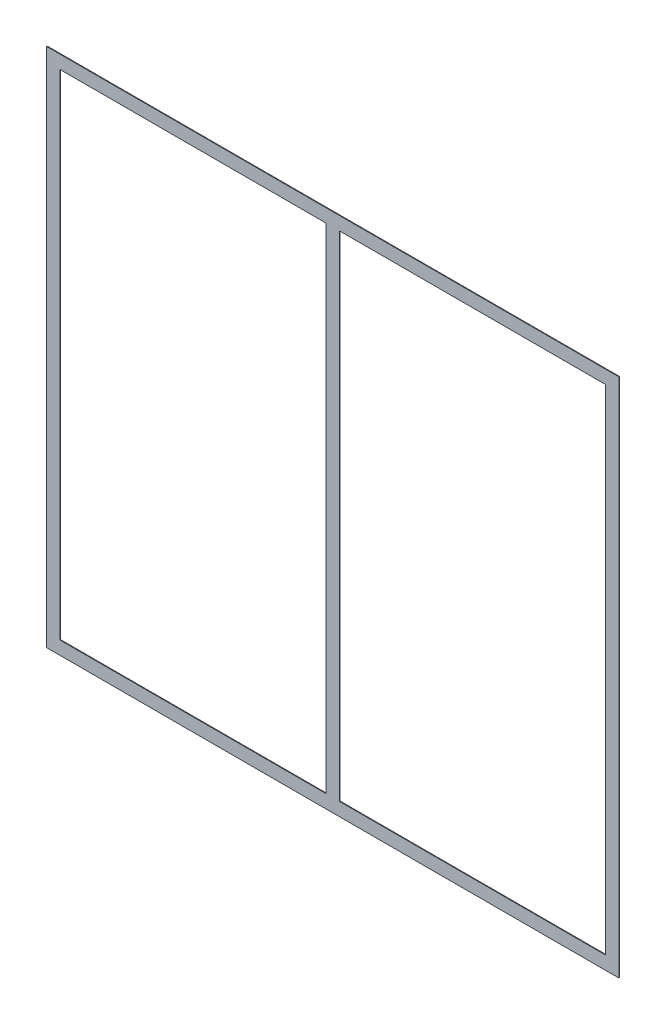
ISO-10303-21;
HEADER;
FILE_DESCRIPTION(('STEP AP214'),'2;1');
FILE_NAME('part.step','',(''),(''),'','','');
FILE_SCHEMA(('AUTOMOTIVE_DESIGN { 1 0 10303 214 1 1 1 1 }'));
ENDSEC;
DATA;
#1=APPLICATION_CONTEXT('core data for automotive mechanical design processes');
#2=APPLICATION_PROTOCOL_DEFINITION('international standard','automotive_design',2000,#1);
#3=PRODUCT_CONTEXT('',#1,'mechanical');
#4=PRODUCT('Part','Part','',(#3));
#5=PRODUCT_RELATED_PRODUCT_CATEGORY('part','',(#4));
#6=PRODUCT_DEFINITION_FORMATION('','',#4);
#7=PRODUCT_DEFINITION_CONTEXT('part definition',#1,'design');
#8=PRODUCT_DEFINITION('design','',#6,#7);
#9=PRODUCT_DEFINITION_SHAPE('','',#8);
#10=(LENGTH_UNIT() NAMED_UNIT(*) SI_UNIT(.MILLI.,.METRE.));
#11=(NAMED_UNIT(*) PLANE_ANGLE_UNIT() SI_UNIT($,.RADIAN.));
#12=(NAMED_UNIT(*) SI_UNIT($,.STERADIAN.) SOLID_ANGLE_UNIT());
#13=UNCERTAINTY_MEASURE_WITH_UNIT(LENGTH_MEASURE(1.E-05),#10,'distance_accuracy_value','');
#14=(GEOMETRIC_REPRESENTATION_CONTEXT(3) GLOBAL_UNCERTAINTY_ASSIGNED_CONTEXT((#13)) GLOBAL_UNIT_ASSIGNED_CONTEXT((#10,
#11,#12)) REPRESENTATION_CONTEXT('',''));
#15=CARTESIAN_POINT('',(0.,0.,0.));
#16=DIRECTION('',(0.,0.,1.));
#17=DIRECTION('',(1.,0.,0.));
#18=AXIS2_PLACEMENT_3D('',#15,#16,#17);
#19=CARTESIAN_POINT('',(571.5,-1177.925,0.));
#20=DIRECTION('',(0.,-1.,0.));
#21=DIRECTION('',(0.,0.,-1.));
#22=AXIS2_PLACEMENT_3D('',#19,#20,#21);
#23=PLANE('',#22);
#24=DIRECTION('',(1.,0.,0.));
#25=VECTOR('',#24,1.);
#26=CARTESIAN_POINT('',(571.5,-1177.925,0.));
#27=LINE('',#26,#25);
#28=CARTESIAN_POINT('',(571.5,-1177.925,0.));
#29=VERTEX_POINT('',#28);
#30=CARTESIAN_POINT('',(1587.5,-1177.925,0.));
#31=VERTEX_POINT('',#30);
#32=EDGE_CURVE('E34',#29,#31,#27,.T.);
#33=ORIENTED_EDGE('',*,*,#32,.F.);
#34=DIRECTION('',(0.,0.,1.));
#35=VECTOR('',#34,1.);
#36=CARTESIAN_POINT('',(571.5,-1177.925,0.));
#37=LINE('',#36,#35);
#38=CARTESIAN_POINT('',(571.5,-1177.925,2.54));
#39=VERTEX_POINT('',#38);
#40=EDGE_CURVE('E10',#29,#39,#37,.T.);
#41=ORIENTED_EDGE('',*,*,#40,.T.);
#42=DIRECTION('',(-1.,0.,0.));
#43=VECTOR('',#42,1.);
#44=CARTESIAN_POINT('',(1587.5,-1177.925,2.54));
#45=LINE('',#44,#43);
#46=CARTESIAN_POINT('',(1587.5,-1177.925,2.54));
#47=VERTEX_POINT('',#46);
#48=EDGE_CURVE('E133',#47,#39,#45,.T.);
#49=ORIENTED_EDGE('',*,*,#48,.F.);
#50=DIRECTION('',(0.,0.,1.));
#51=VECTOR('',#50,1.);
#52=CARTESIAN_POINT('',(1587.5,-1177.925,0.));
#53=LINE('',#52,#51);
#54=EDGE_CURVE('E233',#31,#47,#53,.T.);
#55=ORIENTED_EDGE('',*,*,#54,.F.);
#56=EDGE_LOOP('',(#33,#41,#49,#55));
#57=FACE_BOUND('',#56,.T.);
#58=ADVANCED_FACE('F16',(#57),#23,.F.);
#59=CARTESIAN_POINT('',(571.499999999999,708.025,0.));
#60=DIRECTION('',(-1.,0.,0.));
#61=DIRECTION('',(0.,0.,1.));
#62=AXIS2_PLACEMENT_3D('',#59,#60,#61);
#63=PLANE('',#62);
#64=DIRECTION('',(0.,-1.,0.));
#65=VECTOR('',#64,1.);
#66=CARTESIAN_POINT('',(571.499999999999,708.025,0.));
#67=LINE('',#66,#65);
#68=CARTESIAN_POINT('',(571.499999999999,708.025,0.));
#69=VERTEX_POINT('',#68);
#70=EDGE_CURVE('E214',#69,#29,#67,.T.);
#71=ORIENTED_EDGE('',*,*,#70,.F.);
#72=DIRECTION('',(0.,0.,1.));
#73=VECTOR('',#72,1.);
#74=CARTESIAN_POINT('',(571.499999999999,708.025,0.));
#75=LINE('',#74,#73);
#76=CARTESIAN_POINT('',(571.499999999999,708.025,2.54));
#77=VERTEX_POINT('',#76);
#78=EDGE_CURVE('E26',#69,#77,#75,.T.);
#79=ORIENTED_EDGE('',*,*,#78,.T.);
#80=DIRECTION('',(0.,1.,0.));
#81=VECTOR('',#80,1.);
#82=CARTESIAN_POINT('',(571.5,-1177.925,2.54));
#83=LINE('',#82,#81);
#84=EDGE_CURVE('E243',#39,#77,#83,.T.);
#85=ORIENTED_EDGE('',*,*,#84,.F.);
#86=ORIENTED_EDGE('',*,*,#40,.F.);
#87=EDGE_LOOP('',(#71,#79,#85,#86));
#88=FACE_BOUND('',#87,.T.);
#89=ADVANCED_FACE('F170',(#88),#63,.F.);
#90=CARTESIAN_POINT('',(1587.5,708.025,0.));
#91=DIRECTION('',(0.,1.,0.));
#92=DIRECTION('',(0.,0.,1.));
#93=AXIS2_PLACEMENT_3D('',#90,#91,#92);
#94=PLANE('',#93);
#95=DIRECTION('',(-1.,0.,0.));
#96=VECTOR('',#95,1.);
#97=CARTESIAN_POINT('',(1587.5,708.025,0.));
#98=LINE('',#97,#96);
#99=CARTESIAN_POINT('',(1587.5,708.025,0.));
#100=VERTEX_POINT('',#99);
#101=EDGE_CURVE('E241',#100,#69,#98,.T.);
#102=ORIENTED_EDGE('',*,*,#101,.F.);
#103=DIRECTION('',(0.,0.,1.));
#104=VECTOR('',#103,1.);
#105=CARTESIAN_POINT('',(1587.5,708.025,0.));
#106=LINE('',#105,#104);
#107=CARTESIAN_POINT('',(1587.5,708.025,2.54));
#108=VERTEX_POINT('',#107);
#109=EDGE_CURVE('E244',#100,#108,#106,.T.);
#110=ORIENTED_EDGE('',*,*,#109,.T.);
#111=DIRECTION('',(1.,0.,0.));
#112=VECTOR('',#111,1.);
#113=CARTESIAN_POINT('',(571.499999999999,708.025,2.54));
#114=LINE('',#113,#112);
#115=EDGE_CURVE('E237',#77,#108,#114,.T.);
#116=ORIENTED_EDGE('',*,*,#115,.F.);
#117=ORIENTED_EDGE('',*,*,#78,.F.);
#118=EDGE_LOOP('',(#102,#110,#116,#117));
#119=FACE_BOUND('',#118,.T.);
#120=ADVANCED_FACE('F175',(#119),#94,.F.);
#121=CARTESIAN_POINT('',(1587.5,-1177.925,0.));
#122=DIRECTION('',(1.,0.,0.));
#123=DIRECTION('',(0.,0.,-1.));
#124=AXIS2_PLACEMENT_3D('',#121,#122,#123);
#125=PLANE('',#124);
#126=DIRECTION('',(0.,1.,0.));
#127=VECTOR('',#126,1.);
#128=CARTESIAN_POINT('',(1587.5,-1177.925,0.));
#129=LINE('',#128,#127);
#130=EDGE_CURVE('E238',#31,#100,#129,.T.);
#131=ORIENTED_EDGE('',*,*,#130,.F.);
#132=ORIENTED_EDGE('',*,*,#54,.T.);
#133=DIRECTION('',(0.,-1.,0.));
#134=VECTOR('',#133,1.);
#135=CARTESIAN_POINT('',(1587.5,708.025,2.54));
#136=LINE('',#135,#134);
#137=EDGE_CURVE('E231',#108,#47,#136,.T.);
#138=ORIENTED_EDGE('',*,*,#137,.F.);
#139=ORIENTED_EDGE('',*,*,#109,.F.);
#140=EDGE_LOOP('',(#131,#132,#138,#139));
#141=FACE_BOUND('',#140,.T.);
#142=ADVANCED_FACE('F181',(#141),#125,.F.);
#143=CARTESIAN_POINT('',(520.699999999999,708.025,0.));
#144=DIRECTION('',(0.,1.,0.));
#145=DIRECTION('',(0.,0.,1.));
#146=AXIS2_PLACEMENT_3D('',#143,#144,#145);
#147=PLANE('',#146);
#148=DIRECTION('',(-1.,0.,0.));
#149=VECTOR('',#148,1.);
#150=CARTESIAN_POINT('',(520.699999999999,708.025,0.));
#151=LINE('',#150,#149);
#152=CARTESIAN_POINT('',(520.699999999999,708.025,0.));
#153=VERTEX_POINT('',#152);
#154=CARTESIAN_POINT('',(-495.300000000001,708.024999999999,0.));
#155=VERTEX_POINT('',#154);
#156=EDGE_CURVE('E211',#153,#155,#151,.T.);
#157=ORIENTED_EDGE('',*,*,#156,.F.);
#158=DIRECTION('',(0.,0.,1.));
#159=VECTOR('',#158,1.);
#160=CARTESIAN_POINT('',(520.699999999999,708.025,0.));
#161=LINE('',#160,#159);
#162=CARTESIAN_POINT('',(520.699999999999,708.025,2.54));
#163=VERTEX_POINT('',#162);
#164=EDGE_CURVE('E227',#153,#163,#161,.T.);
#165=ORIENTED_EDGE('',*,*,#164,.T.);
#166=DIRECTION('',(1.,0.,0.));
#167=VECTOR('',#166,1.);
#168=CARTESIAN_POINT('',(-495.300000000001,708.024999999999,2.54));
#169=LINE('',#168,#167);
#170=CARTESIAN_POINT('',(-495.300000000001,708.024999999999,2.54));
#171=VERTEX_POINT('',#170);
#172=EDGE_CURVE('E224',#171,#163,#169,.T.);
#173=ORIENTED_EDGE('',*,*,#172,.F.);
#174=DIRECTION('',(0.,0.,1.));
#175=VECTOR('',#174,1.);
#176=CARTESIAN_POINT('',(-495.300000000001,708.024999999999,0.));
#177=LINE('',#176,#175);
#178=EDGE_CURVE('E138',#155,#171,#177,.T.);
#179=ORIENTED_EDGE('',*,*,#178,.F.);
#180=EDGE_LOOP('',(#157,#165,#173,#179));
#181=FACE_BOUND('',#180,.T.);
#182=ADVANCED_FACE('F185',(#181),#147,.F.);
#183=CARTESIAN_POINT('',(520.7,-1177.925,0.));
#184=DIRECTION('',(1.,0.,0.));
#185=DIRECTION('',(0.,0.,-1.));
#186=AXIS2_PLACEMENT_3D('',#183,#184,#185);
#187=PLANE('',#186);
#188=DIRECTION('',(0.,1.,0.));
#189=VECTOR('',#188,1.);
#190=CARTESIAN_POINT('',(520.7,-1177.925,0.));
#191=LINE('',#190,#189);
#192=CARTESIAN_POINT('',(520.7,-1177.925,0.));
#193=VERTEX_POINT('',#192);
#194=EDGE_CURVE('E216',#193,#153,#191,.T.);
#195=ORIENTED_EDGE('',*,*,#194,.F.);
#196=DIRECTION('',(0.,0.,1.));
#197=VECTOR('',#196,1.);
#198=CARTESIAN_POINT('',(520.7,-1177.925,0.));
#199=LINE('',#198,#197);
#200=CARTESIAN_POINT('',(520.7,-1177.925,2.54));
#201=VERTEX_POINT('',#200);
#202=EDGE_CURVE('E221',#193,#201,#199,.T.);
#203=ORIENTED_EDGE('',*,*,#202,.T.);
#204=DIRECTION('',(0.,-1.,0.));
#205=VECTOR('',#204,1.);
#206=CARTESIAN_POINT('',(520.699999999999,708.025,2.54));
#207=LINE('',#206,#205);
#208=EDGE_CURVE('E220',#163,#201,#207,.T.);
#209=ORIENTED_EDGE('',*,*,#208,.F.);
#210=ORIENTED_EDGE('',*,*,#164,.F.);
#211=EDGE_LOOP('',(#195,#203,#209,#210));
#212=FACE_BOUND('',#211,.T.);
#213=ADVANCED_FACE('F189',(#212),#187,.F.);
#214=CARTESIAN_POINT('',(-495.3,-1177.925,0.));
#215=DIRECTION('',(0.,-1.,0.));
#216=DIRECTION('',(0.,0.,-1.));
#217=AXIS2_PLACEMENT_3D('',#214,#215,#216);
#218=PLANE('',#217);
#219=DIRECTION('',(1.,0.,0.));
#220=VECTOR('',#219,1.);
#221=CARTESIAN_POINT('',(-495.3,-1177.925,0.));
#222=LINE('',#221,#220);
#223=CARTESIAN_POINT('',(-495.3,-1177.925,0.));
#224=VERTEX_POINT('',#223);
#225=EDGE_CURVE('E212',#224,#193,#222,.T.);
#226=ORIENTED_EDGE('',*,*,#225,.F.);
#227=DIRECTION('',(0.,0.,1.));
#228=VECTOR('',#227,1.);
#229=CARTESIAN_POINT('',(-495.3,-1177.925,0.));
#230=LINE('',#229,#228);
#231=CARTESIAN_POINT('',(-495.3,-1177.925,2.54));
#232=VERTEX_POINT('',#231);
#233=EDGE_CURVE('E142',#224,#232,#230,.T.);
#234=ORIENTED_EDGE('',*,*,#233,.T.);
#235=DIRECTION('',(-1.,0.,0.));
#236=VECTOR('',#235,1.);
#237=CARTESIAN_POINT('',(520.7,-1177.925,2.54));
#238=LINE('',#237,#236);
#239=EDGE_CURVE('E154',#201,#232,#238,.T.);
#240=ORIENTED_EDGE('',*,*,#239,.F.);
#241=ORIENTED_EDGE('',*,*,#202,.F.);
#242=EDGE_LOOP('',(#226,#234,#240,#241));
#243=FACE_BOUND('',#242,.T.);
#244=ADVANCED_FACE('F193',(#243),#218,.F.);
#245=CARTESIAN_POINT('',(-495.300000000001,708.024999999999,0.));
#246=DIRECTION('',(-1.,0.,0.));
#247=DIRECTION('',(0.,0.,1.));
#248=AXIS2_PLACEMENT_3D('',#245,#246,#247);
#249=PLANE('',#248);
#250=DIRECTION('',(0.,-1.,0.));
#251=VECTOR('',#250,1.);
#252=CARTESIAN_POINT('',(-495.300000000001,708.024999999999,0.));
#253=LINE('',#252,#251);
#254=EDGE_CURVE('E205',#155,#224,#253,.T.);
#255=ORIENTED_EDGE('',*,*,#254,.F.);
#256=ORIENTED_EDGE('',*,*,#178,.T.);
#257=DIRECTION('',(0.,1.,0.));
#258=VECTOR('',#257,1.);
#259=CARTESIAN_POINT('',(-495.3,-1177.925,2.54));
#260=LINE('',#259,#258);
#261=EDGE_CURVE('E152',#232,#171,#260,.T.);
#262=ORIENTED_EDGE('',*,*,#261,.F.);
#263=ORIENTED_EDGE('',*,*,#233,.F.);
#264=EDGE_LOOP('',(#255,#256,#262,#263));
#265=FACE_BOUND('',#264,.T.);
#266=ADVANCED_FACE('F167',(#265),#249,.F.);
#267=CARTESIAN_POINT('',(-546.1,-1228.725,0.));
#268=DIRECTION('',(0.,-1.,0.));
#269=DIRECTION('',(0.,0.,-1.));
#270=AXIS2_PLACEMENT_3D('',#267,#268,#269);
#271=PLANE('',#270);
#272=DIRECTION('',(-1.,0.,0.));
#273=VECTOR('',#272,1.);
#274=CARTESIAN_POINT('',(1638.3,-1228.725,0.));
#275=LINE('',#274,#273);
#276=CARTESIAN_POINT('',(1638.3,-1228.725,0.));
#277=VERTEX_POINT('',#276);
#278=CARTESIAN_POINT('',(-546.1,-1228.725,0.));
#279=VERTEX_POINT('',#278);
#280=EDGE_CURVE('E137',#277,#279,#275,.T.);
#281=ORIENTED_EDGE('',*,*,#280,.F.);
#282=DIRECTION('',(0.,0.,1.));
#283=VECTOR('',#282,1.);
#284=CARTESIAN_POINT('',(1638.3,-1228.725,0.));
#285=LINE('',#284,#283);
#286=CARTESIAN_POINT('',(1638.3,-1228.725,2.54));
#287=VERTEX_POINT('',#286);
#288=EDGE_CURVE('E135',#277,#287,#285,.T.);
#289=ORIENTED_EDGE('',*,*,#288,.T.);
#290=DIRECTION('',(1.,0.,0.));
#291=VECTOR('',#290,1.);
#292=CARTESIAN_POINT('',(-546.1,-1228.725,2.54));
#293=LINE('',#292,#291);
#294=CARTESIAN_POINT('',(-546.1,-1228.725,2.54));
#295=VERTEX_POINT('',#294);
#296=EDGE_CURVE('E128',#295,#287,#293,.T.);
#297=ORIENTED_EDGE('',*,*,#296,.F.);
#298=DIRECTION('',(0.,0.,1.));
#299=VECTOR('',#298,1.);
#300=CARTESIAN_POINT('',(-546.1,-1228.725,0.));
#301=LINE('',#300,#299);
#302=EDGE_CURVE('E139',#279,#295,#301,.T.);
#303=ORIENTED_EDGE('',*,*,#302,.F.);
#304=EDGE_LOOP('',(#281,#289,#297,#303));
#305=FACE_BOUND('',#304,.T.);
#306=ADVANCED_FACE('F136',(#305),#271,.T.);
#307=CARTESIAN_POINT('',(-546.1,758.825,0.));
#308=DIRECTION('',(-1.,0.,0.));
#309=DIRECTION('',(0.,0.,1.));
#310=AXIS2_PLACEMENT_3D('',#307,#308,#309);
#311=PLANE('',#310);
#312=DIRECTION('',(0.,1.,0.));
#313=VECTOR('',#312,1.);
#314=CARTESIAN_POINT('',(-546.1,-1228.725,0.));
#315=LINE('',#314,#313);
#316=CARTESIAN_POINT('',(-546.1,758.825,0.));
#317=VERTEX_POINT('',#316);
#318=EDGE_CURVE('E148',#279,#317,#315,.T.);
#319=ORIENTED_EDGE('',*,*,#318,.F.);
#320=ORIENTED_EDGE('',*,*,#302,.T.);
#321=DIRECTION('',(0.,-1.,0.));
#322=VECTOR('',#321,1.);
#323=CARTESIAN_POINT('',(-546.1,758.825,2.54));
#324=LINE('',#323,#322);
#325=CARTESIAN_POINT('',(-546.1,758.825,2.54));
#326=VERTEX_POINT('',#325);
#327=EDGE_CURVE('E118',#326,#295,#324,.T.);
#328=ORIENTED_EDGE('',*,*,#327,.F.);
#329=DIRECTION('',(0.,0.,1.));
#330=VECTOR('',#329,1.);
#331=CARTESIAN_POINT('',(-546.1,758.825,0.));
#332=LINE('',#331,#330);
#333=EDGE_CURVE('E114',#317,#326,#332,.T.);
#334=ORIENTED_EDGE('',*,*,#333,.F.);
#335=EDGE_LOOP('',(#319,#320,#328,#334));
#336=FACE_BOUND('',#335,.T.);
#337=ADVANCED_FACE('F158',(#336),#311,.T.);
#338=CARTESIAN_POINT('',(1638.3,758.825,0.));
#339=DIRECTION('',(0.,1.,0.));
#340=DIRECTION('',(0.,0.,1.));
#341=AXIS2_PLACEMENT_3D('',#338,#339,#340);
#342=PLANE('',#341);
#343=DIRECTION('',(1.,0.,0.));
#344=VECTOR('',#343,1.);
#345=CARTESIAN_POINT('',(-546.1,758.825,0.));
#346=LINE('',#345,#344);
#347=CARTESIAN_POINT('',(1638.3,758.825,0.));
#348=VERTEX_POINT('',#347);
#349=EDGE_CURVE('E102',#317,#348,#346,.T.);
#350=ORIENTED_EDGE('',*,*,#349,.F.);
#351=ORIENTED_EDGE('',*,*,#333,.T.);
#352=DIRECTION('',(-1.,0.,0.));
#353=VECTOR('',#352,1.);
#354=CARTESIAN_POINT('',(1638.3,758.825,2.54));
#355=LINE('',#354,#353);
#356=CARTESIAN_POINT('',(1638.3,758.825,2.54));
#357=VERTEX_POINT('',#356);
#358=EDGE_CURVE('E108',#357,#326,#355,.T.);
#359=ORIENTED_EDGE('',*,*,#358,.F.);
#360=DIRECTION('',(0.,0.,1.));
#361=VECTOR('',#360,1.);
#362=CARTESIAN_POINT('',(1638.3,758.825,0.));
#363=LINE('',#362,#361);
#364=EDGE_CURVE('E111',#348,#357,#363,.T.);
#365=ORIENTED_EDGE('',*,*,#364,.F.);
#366=EDGE_LOOP('',(#350,#351,#359,#365));
#367=FACE_BOUND('',#366,.T.);
#368=ADVANCED_FACE('F110',(#367),#342,.T.);
#369=CARTESIAN_POINT('',(1638.3,-1228.725,0.));
#370=DIRECTION('',(1.,0.,0.));
#371=DIRECTION('',(0.,0.,-1.));
#372=AXIS2_PLACEMENT_3D('',#369,#370,#371);
#373=PLANE('',#372);
#374=DIRECTION('',(0.,-1.,0.));
#375=VECTOR('',#374,1.);
#376=CARTESIAN_POINT('',(1638.3,758.825,0.));
#377=LINE('',#376,#375);
#378=EDGE_CURVE('E124',#348,#277,#377,.T.);
#379=ORIENTED_EDGE('',*,*,#378,.F.);
#380=ORIENTED_EDGE('',*,*,#364,.T.);
#381=DIRECTION('',(0.,1.,0.));
#382=VECTOR('',#381,1.);
#383=CARTESIAN_POINT('',(1638.3,-1228.725,2.54));
#384=LINE('',#383,#382);
#385=EDGE_CURVE('E20',#287,#357,#384,.T.);
#386=ORIENTED_EDGE('',*,*,#385,.F.);
#387=ORIENTED_EDGE('',*,*,#288,.F.);
#388=EDGE_LOOP('',(#379,#380,#386,#387));
#389=FACE_BOUND('',#388,.T.);
#390=ADVANCED_FACE('F122',(#389),#373,.T.);
#391=CARTESIAN_POINT('',(546.1,-234.95,2.54));
#392=DIRECTION('',(0.,0.,-1.));
#393=DIRECTION('',(-1.,0.,0.));
#394=AXIS2_PLACEMENT_3D('',#391,#392,#393);
#395=PLANE('',#394);
#396=ORIENTED_EDGE('',*,*,#385,.T.);
#397=ORIENTED_EDGE('',*,*,#358,.T.);
#398=ORIENTED_EDGE('',*,*,#327,.T.);
#399=ORIENTED_EDGE('',*,*,#296,.T.);
#400=EDGE_LOOP('',(#396,#397,#398,#399));
#401=FACE_BOUND('',#400,.T.);
#402=ORIENTED_EDGE('',*,*,#48,.T.);
#403=ORIENTED_EDGE('',*,*,#84,.T.);
#404=ORIENTED_EDGE('',*,*,#115,.T.);
#405=ORIENTED_EDGE('',*,*,#137,.T.);
#406=EDGE_LOOP('',(#402,#403,#404,#405));
#407=FACE_BOUND('',#406,.T.);
#408=ORIENTED_EDGE('',*,*,#172,.T.);
#409=ORIENTED_EDGE('',*,*,#208,.T.);
#410=ORIENTED_EDGE('',*,*,#239,.T.);
#411=ORIENTED_EDGE('',*,*,#261,.T.);
#412=EDGE_LOOP('',(#408,#409,#410,#411));
#413=FACE_BOUND('',#412,.T.);
#414=ADVANCED_FACE('F126',(#401,#407,#413),#395,.F.);
#415=CARTESIAN_POINT('',(546.1,-234.95,0.));
#416=DIRECTION('',(0.,0.,-1.));
#417=DIRECTION('',(-1.,0.,0.));
#418=AXIS2_PLACEMENT_3D('',#415,#416,#417);
#419=PLANE('',#418);
#420=ORIENTED_EDGE('',*,*,#378,.T.);
#421=ORIENTED_EDGE('',*,*,#280,.T.);
#422=ORIENTED_EDGE('',*,*,#318,.T.);
#423=ORIENTED_EDGE('',*,*,#349,.T.);
#424=EDGE_LOOP('',(#420,#421,#422,#423));
#425=FACE_BOUND('',#424,.T.);
#426=ORIENTED_EDGE('',*,*,#32,.T.);
#427=ORIENTED_EDGE('',*,*,#130,.T.);
#428=ORIENTED_EDGE('',*,*,#101,.T.);
#429=ORIENTED_EDGE('',*,*,#70,.T.);
#430=EDGE_LOOP('',(#426,#427,#428,#429));
#431=FACE_BOUND('',#430,.T.);
#432=ORIENTED_EDGE('',*,*,#156,.T.);
#433=ORIENTED_EDGE('',*,*,#254,.T.);
#434=ORIENTED_EDGE('',*,*,#225,.T.);
#435=ORIENTED_EDGE('',*,*,#194,.T.);
#436=EDGE_LOOP('',(#432,#433,#434,#435));
#437=FACE_BOUND('',#436,.T.);
#438=ADVANCED_FACE('F18',(#425,#431,#437),#419,.T.);
#439=CLOSED_SHELL('',(#58,#89,#120,#142,#182,#213,#244,#266,#306,#337,#368,#390,#414,#438));
#440=MANIFOLD_SOLID_BREP('B1',#439);
#441=ADVANCED_BREP_SHAPE_REPRESENTATION('',(#18,#440),#14);
#442=SHAPE_DEFINITION_REPRESENTATION(#9,#441);
ENDSEC;
END-ISO-10303-21;
